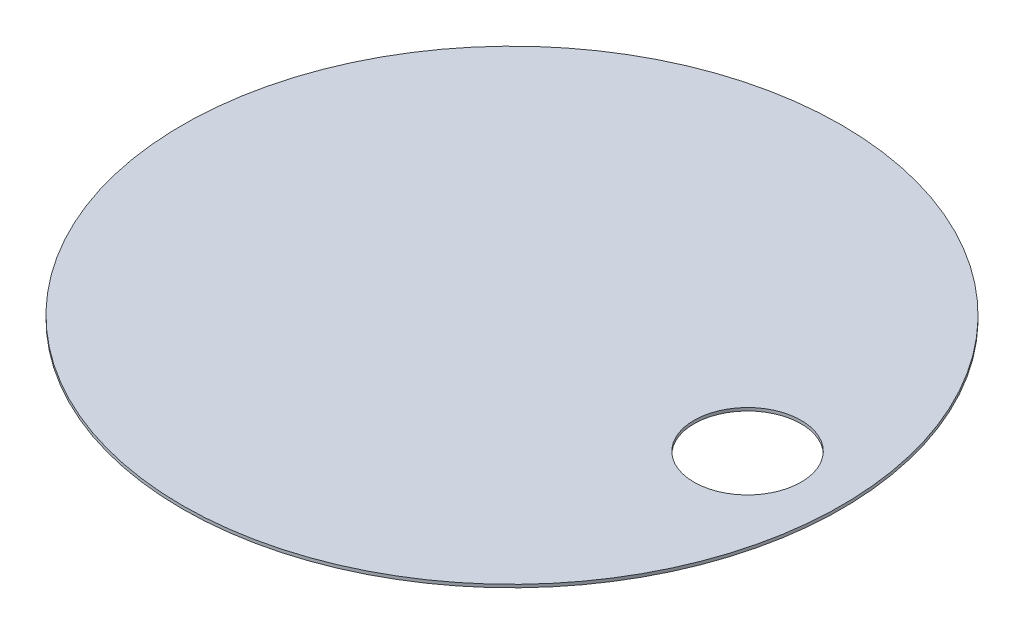
ISO-10303-21;
HEADER;
FILE_DESCRIPTION(('STEP AP214'),'2;1');
FILE_NAME('part.step','',(''),(''),'','','');
FILE_SCHEMA(('AUTOMOTIVE_DESIGN { 1 0 10303 214 1 1 1 1 }'));
ENDSEC;
DATA;
#1=APPLICATION_CONTEXT('core data for automotive mechanical design processes');
#2=APPLICATION_PROTOCOL_DEFINITION('international standard','automotive_design',2000,#1);
#3=PRODUCT_CONTEXT('',#1,'mechanical');
#4=PRODUCT('Part','Part','',(#3));
#5=PRODUCT_RELATED_PRODUCT_CATEGORY('part','',(#4));
#6=PRODUCT_DEFINITION_FORMATION('','',#4);
#7=PRODUCT_DEFINITION_CONTEXT('part definition',#1,'design');
#8=PRODUCT_DEFINITION('design','',#6,#7);
#9=PRODUCT_DEFINITION_SHAPE('','',#8);
#10=(LENGTH_UNIT() NAMED_UNIT(*) SI_UNIT(.MILLI.,.METRE.));
#11=(NAMED_UNIT(*) PLANE_ANGLE_UNIT() SI_UNIT($,.RADIAN.));
#12=(NAMED_UNIT(*) SI_UNIT($,.STERADIAN.) SOLID_ANGLE_UNIT());
#13=UNCERTAINTY_MEASURE_WITH_UNIT(LENGTH_MEASURE(1.E-05),#10,'distance_accuracy_value','');
#14=(GEOMETRIC_REPRESENTATION_CONTEXT(3) GLOBAL_UNCERTAINTY_ASSIGNED_CONTEXT((#13)) GLOBAL_UNIT_ASSIGNED_CONTEXT((#10,
#11,#12)) REPRESENTATION_CONTEXT('',''));
#15=CARTESIAN_POINT('',(0.,0.,0.));
#16=DIRECTION('',(0.,0.,1.));
#17=DIRECTION('',(1.,0.,0.));
#18=AXIS2_PLACEMENT_3D('',#15,#16,#17);
#19=CARTESIAN_POINT('',(0.,1.5,0.));
#20=DIRECTION('',(0.,-1.,0.));
#21=DIRECTION('',(0.,0.,-1.));
#22=AXIS2_PLACEMENT_3D('',#19,#20,#21);
#23=CYLINDRICAL_SURFACE('',#22,326.);
#24=CARTESIAN_POINT('',(0.,1.5,0.));
#25=DIRECTION('',(0.,1.,0.));
#26=DIRECTION('',(0.,0.,1.));
#27=AXIS2_PLACEMENT_3D('',#24,#25,#26);
#28=CIRCLE('',#27,326.);
#29=CARTESIAN_POINT('',(0.,1.5,326.));
#30=VERTEX_POINT('',#29);
#31=EDGE_CURVE('E10',#30,#30,#28,.T.);
#32=ORIENTED_EDGE('',*,*,#31,.F.);
#33=EDGE_LOOP('',(#32));
#34=FACE_BOUND('',#33,.T.);
#35=CARTESIAN_POINT('',(0.,-1.5,0.));
#36=DIRECTION('',(0.,1.,0.));
#37=DIRECTION('',(0.,0.,1.));
#38=AXIS2_PLACEMENT_3D('',#35,#36,#37);
#39=CIRCLE('',#38,326.);
#40=CARTESIAN_POINT('',(0.,-1.5,326.));
#41=VERTEX_POINT('',#40);
#42=EDGE_CURVE('E49',#41,#41,#39,.T.);
#43=ORIENTED_EDGE('',*,*,#42,.T.);
#44=EDGE_LOOP('',(#43));
#45=FACE_BOUND('',#44,.T.);
#46=ADVANCED_FACE('F41',(#34,#45),#23,.T.);
#47=CARTESIAN_POINT('',(0.,1.5,0.));
#48=DIRECTION('',(0.,1.,0.));
#49=DIRECTION('',(0.,0.,1.));
#50=AXIS2_PLACEMENT_3D('',#47,#48,#49);
#51=PLANE('',#50);
#52=CARTESIAN_POINT('',(233.,1.5,0.));
#53=DIRECTION('',(0.,1.,0.));
#54=DIRECTION('',(0.,0.,1.));
#55=AXIS2_PLACEMENT_3D('',#52,#53,#54);
#56=CIRCLE('',#55,53.);
#57=CARTESIAN_POINT('',(233.,1.5,53.));
#58=VERTEX_POINT('',#57);
#59=EDGE_CURVE('E70',#58,#58,#56,.T.);
#60=ORIENTED_EDGE('',*,*,#59,.F.);
#61=EDGE_LOOP('',(#60));
#62=FACE_BOUND('',#61,.T.);
#63=ORIENTED_EDGE('',*,*,#31,.T.);
#64=EDGE_LOOP('',(#63));
#65=FACE_BOUND('',#64,.T.);
#66=ADVANCED_FACE('F80',(#62,#65),#51,.T.);
#67=CARTESIAN_POINT('',(0.,-1.5,0.));
#68=DIRECTION('',(0.,1.,0.));
#69=DIRECTION('',(0.,0.,1.));
#70=AXIS2_PLACEMENT_3D('',#67,#68,#69);
#71=PLANE('',#70);
#72=CARTESIAN_POINT('',(233.,-1.5,0.));
#73=DIRECTION('',(0.,1.,0.));
#74=DIRECTION('',(0.,0.,1.));
#75=AXIS2_PLACEMENT_3D('',#72,#73,#74);
#76=CIRCLE('',#75,53.);
#77=CARTESIAN_POINT('',(233.,-1.5,53.));
#78=VERTEX_POINT('',#77);
#79=EDGE_CURVE('E44',#78,#78,#76,.T.);
#80=ORIENTED_EDGE('',*,*,#79,.T.);
#81=EDGE_LOOP('',(#80));
#82=FACE_BOUND('',#81,.T.);
#83=CARTESIAN_POINT('',(0.,-1.5,0.));
#84=DIRECTION('',(0.,1.,0.));
#85=DIRECTION('',(0.,0.,1.));
#86=AXIS2_PLACEMENT_3D('',#83,#84,#85);
#87=CIRCLE('',#86,10.);
#88=CARTESIAN_POINT('',(0.,-1.5,10.));
#89=VERTEX_POINT('',#88);
#90=EDGE_CURVE('E55',#89,#89,#87,.T.);
#91=ORIENTED_EDGE('',*,*,#90,.T.);
#92=EDGE_LOOP('',(#91));
#93=FACE_BOUND('',#92,.T.);
#94=ORIENTED_EDGE('',*,*,#42,.F.);
#95=EDGE_LOOP('',(#94));
#96=FACE_BOUND('',#95,.T.);
#97=ADVANCED_FACE('F82',(#82,#93,#96),#71,.F.);
#98=CARTESIAN_POINT('',(0.,-6.,0.));
#99=DIRECTION('',(0.,1.,0.));
#100=DIRECTION('',(0.,0.,1.));
#101=AXIS2_PLACEMENT_3D('',#98,#99,#100);
#102=CYLINDRICAL_SURFACE('',#101,10.);
#103=CARTESIAN_POINT('',(0.,-6.,0.));
#104=DIRECTION('',(0.,1.,0.));
#105=DIRECTION('',(0.,0.,1.));
#106=AXIS2_PLACEMENT_3D('',#103,#104,#105);
#107=CIRCLE('',#106,10.);
#108=CARTESIAN_POINT('',(0.,-6.,10.));
#109=VERTEX_POINT('',#108);
#110=EDGE_CURVE('E58',#109,#109,#107,.T.);
#111=ORIENTED_EDGE('',*,*,#110,.T.);
#112=EDGE_LOOP('',(#111));
#113=FACE_BOUND('',#112,.T.);
#114=ORIENTED_EDGE('',*,*,#90,.F.);
#115=EDGE_LOOP('',(#114));
#116=FACE_BOUND('',#115,.T.);
#117=ADVANCED_FACE('F88',(#113,#116),#102,.T.);
#118=CARTESIAN_POINT('',(0.,-6.,0.));
#119=DIRECTION('',(0.,1.,0.));
#120=DIRECTION('',(0.,0.,1.));
#121=AXIS2_PLACEMENT_3D('',#118,#119,#120);
#122=PLANE('',#121);
#123=ORIENTED_EDGE('',*,*,#110,.F.);
#124=EDGE_LOOP('',(#123));
#125=FACE_BOUND('',#124,.T.);
#126=ADVANCED_FACE('F93',(#125),#122,.F.);
#127=CARTESIAN_POINT('',(233.,-6.,0.));
#128=DIRECTION('',(0.,1.,0.));
#129=DIRECTION('',(0.,0.,1.));
#130=AXIS2_PLACEMENT_3D('',#127,#128,#129);
#131=CYLINDRICAL_SURFACE('',#130,53.);
#132=ORIENTED_EDGE('',*,*,#59,.T.);
#133=EDGE_LOOP('',(#132));
#134=FACE_BOUND('',#133,.T.);
#135=ORIENTED_EDGE('',*,*,#79,.F.);
#136=EDGE_LOOP('',(#135));
#137=FACE_BOUND('',#136,.T.);
#138=ADVANCED_FACE('F77',(#134,#137),#131,.F.);
#139=CLOSED_SHELL('',(#46,#66,#97,#117,#126,#138));
#140=MANIFOLD_SOLID_BREP('B2',#139);
#141=ADVANCED_BREP_SHAPE_REPRESENTATION('',(#18,#140),#14);
#142=SHAPE_DEFINITION_REPRESENTATION(#9,#141);
ENDSEC;
END-ISO-10303-21;
